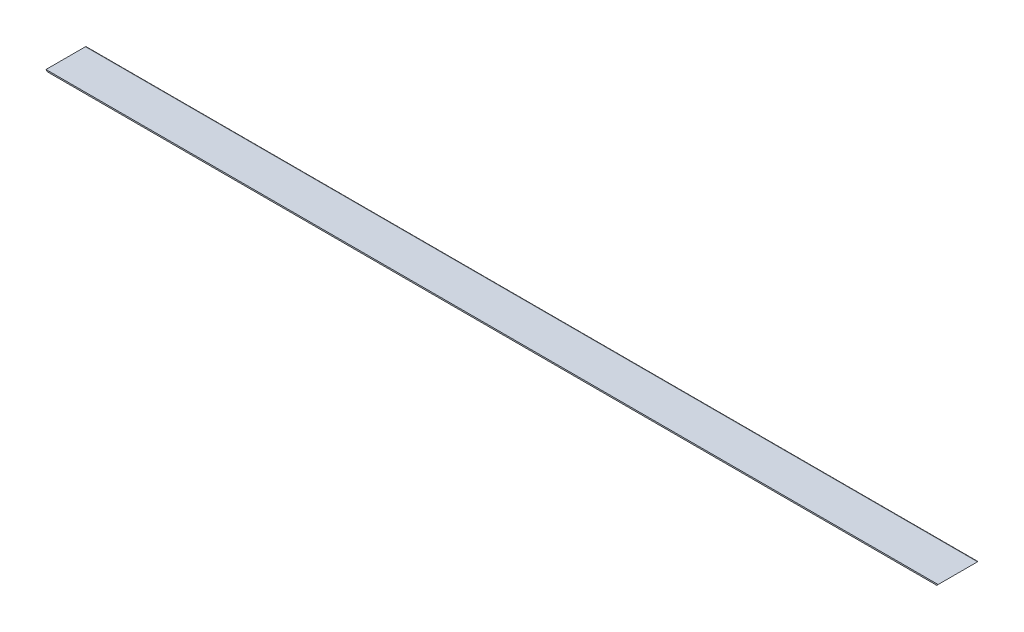
ISO-10303-21;
HEADER;
FILE_DESCRIPTION(('STEP AP214'),'2;1');
FILE_NAME('part.step','',(''),(''),'','','');
FILE_SCHEMA(('AUTOMOTIVE_DESIGN { 1 0 10303 214 1 1 1 1 }'));
ENDSEC;
DATA;
#1=APPLICATION_CONTEXT('core data for automotive mechanical design processes');
#2=APPLICATION_PROTOCOL_DEFINITION('international standard','automotive_design',2000,#1);
#3=PRODUCT_CONTEXT('',#1,'mechanical');
#4=PRODUCT('Part','Part','',(#3));
#5=PRODUCT_RELATED_PRODUCT_CATEGORY('part','',(#4));
#6=PRODUCT_DEFINITION_FORMATION('','',#4);
#7=PRODUCT_DEFINITION_CONTEXT('part definition',#1,'design');
#8=PRODUCT_DEFINITION('design','',#6,#7);
#9=PRODUCT_DEFINITION_SHAPE('','',#8);
#10=(LENGTH_UNIT() NAMED_UNIT(*) SI_UNIT(.MILLI.,.METRE.));
#11=(NAMED_UNIT(*) PLANE_ANGLE_UNIT() SI_UNIT($,.RADIAN.));
#12=(NAMED_UNIT(*) SI_UNIT($,.STERADIAN.) SOLID_ANGLE_UNIT());
#13=UNCERTAINTY_MEASURE_WITH_UNIT(LENGTH_MEASURE(1.E-05),#10,'distance_accuracy_value','');
#14=(GEOMETRIC_REPRESENTATION_CONTEXT(3) GLOBAL_UNCERTAINTY_ASSIGNED_CONTEXT((#13)) GLOBAL_UNIT_ASSIGNED_CONTEXT((#10,
#11,#12)) REPRESENTATION_CONTEXT('',''));
#15=CARTESIAN_POINT('',(0.,0.,0.));
#16=DIRECTION('',(0.,0.,1.));
#17=DIRECTION('',(1.,0.,0.));
#18=AXIS2_PLACEMENT_3D('',#15,#16,#17);
#19=CARTESIAN_POINT('',(1930.,0.,0.));
#20=DIRECTION('',(0.,0.,-1.));
#21=DIRECTION('',(-1.,0.,0.));
#22=AXIS2_PLACEMENT_3D('',#19,#20,#21);
#23=PLANE('',#22);
#24=DIRECTION('',(-1.,0.,0.));
#25=VECTOR('',#24,1.);
#26=CARTESIAN_POINT('',(1930.,-3.,0.));
#27=LINE('',#26,#25);
#28=CARTESIAN_POINT('',(1927.,-3.,0.));
#29=VERTEX_POINT('',#28);
#30=CARTESIAN_POINT('',(3.00000000000008,-3.00000000000006,0.));
#31=VERTEX_POINT('',#30);
#32=EDGE_CURVE('E110',#29,#31,#27,.T.);
#33=ORIENTED_EDGE('',*,*,#32,.F.);
#34=DIRECTION('',(0.707106781186543,0.707106781186552,0.));
#35=VECTOR('',#34,1.);
#36=CARTESIAN_POINT('',(1930.,0.,0.));
#37=LINE('',#36,#35);
#38=CARTESIAN_POINT('',(1930.,0.,0.));
#39=VERTEX_POINT('',#38);
#40=EDGE_CURVE('E98',#29,#39,#37,.T.);
#41=ORIENTED_EDGE('',*,*,#40,.T.);
#42=DIRECTION('',(-1.,0.,0.));
#43=VECTOR('',#42,1.);
#44=CARTESIAN_POINT('',(1930.,0.,0.));
#45=LINE('',#44,#43);
#46=CARTESIAN_POINT('',(0.,0.,0.));
#47=VERTEX_POINT('',#46);
#48=EDGE_CURVE('E104',#39,#47,#45,.T.);
#49=ORIENTED_EDGE('',*,*,#48,.T.);
#50=DIRECTION('',(0.707106781186543,-0.707106781186553,0.));
#51=VECTOR('',#50,1.);
#52=CARTESIAN_POINT('',(0.,0.,0.));
#53=LINE('',#52,#51);
#54=EDGE_CURVE('E142',#47,#31,#53,.T.);
#55=ORIENTED_EDGE('',*,*,#54,.T.);
#56=EDGE_LOOP('',(#33,#41,#49,#55));
#57=FACE_BOUND('',#56,.T.);
#58=ADVANCED_FACE('F33',(#57),#23,.F.);
#59=CARTESIAN_POINT('',(1930.,-3.,0.));
#60=DIRECTION('',(0.,1.,0.));
#61=DIRECTION('',(0.,0.,1.));
#62=AXIS2_PLACEMENT_3D('',#59,#60,#61);
#63=PLANE('',#62);
#64=DIRECTION('',(-1.,0.,0.));
#65=VECTOR('',#64,1.);
#66=CARTESIAN_POINT('',(1930.,-3.,-82.));
#67=LINE('',#66,#65);
#68=CARTESIAN_POINT('',(2.99999999999989,-3.,-82.));
#69=VERTEX_POINT('',#68);
#70=CARTESIAN_POINT('',(1927.,-3.,-82.));
#71=VERTEX_POINT('',#70);
#72=EDGE_CURVE('E124',#69,#71,#67,.F.);
#73=ORIENTED_EDGE('',*,*,#72,.T.);
#74=DIRECTION('',(0.,0.,1.));
#75=VECTOR('',#74,1.);
#76=CARTESIAN_POINT('',(1927.,-3.,0.));
#77=LINE('',#76,#75);
#78=EDGE_CURVE('E143',#71,#29,#77,.T.);
#79=ORIENTED_EDGE('',*,*,#78,.T.);
#80=ORIENTED_EDGE('',*,*,#32,.T.);
#81=DIRECTION('',(0.,0.,-1.));
#82=VECTOR('',#81,1.);
#83=CARTESIAN_POINT('',(3.00000000000011,-3.,-6.07784025128593E-13));
#84=LINE('',#83,#82);
#85=EDGE_CURVE('E244',#31,#69,#84,.T.);
#86=ORIENTED_EDGE('',*,*,#85,.T.);
#87=EDGE_LOOP('',(#73,#79,#80,#86));
#88=FACE_BOUND('',#87,.T.);
#89=ADVANCED_FACE('F154',(#88),#63,.F.);
#90=CARTESIAN_POINT('',(1930.,-3.,-85.));
#91=DIRECTION('',(0.,0.,-1.));
#92=DIRECTION('',(-1.,0.,0.));
#93=AXIS2_PLACEMENT_3D('',#90,#91,#92);
#94=PLANE('',#93);
#95=DIRECTION('',(-1.,0.,0.));
#96=VECTOR('',#95,1.);
#97=CARTESIAN_POINT('',(1930.,-88.,-85.));
#98=LINE('',#97,#96);
#99=CARTESIAN_POINT('',(1842.,-88.,-85.));
#100=VERTEX_POINT('',#99);
#101=CARTESIAN_POINT('',(87.9999999999987,-88.,-85.));
#102=VERTEX_POINT('',#101);
#103=EDGE_CURVE('E116',#100,#102,#98,.T.);
#104=ORIENTED_EDGE('',*,*,#103,.F.);
#105=DIRECTION('',(0.707106781186543,0.707106781186552,0.));
#106=VECTOR('',#105,1.);
#107=CARTESIAN_POINT('',(1928.5,-1.50000000000002,-85.));
#108=LINE('',#107,#106);
#109=CARTESIAN_POINT('',(1924.,-6.,-85.));
#110=VERTEX_POINT('',#109);
#111=EDGE_CURVE('E252',#100,#110,#108,.T.);
#112=ORIENTED_EDGE('',*,*,#111,.T.);
#113=DIRECTION('',(-1.,0.,0.));
#114=VECTOR('',#113,1.);
#115=CARTESIAN_POINT('',(0.,-6.,-85.));
#116=LINE('',#115,#114);
#117=CARTESIAN_POINT('',(6.00000000000001,-6.,-85.));
#118=VERTEX_POINT('',#117);
#119=EDGE_CURVE('E122',#110,#118,#116,.T.);
#120=ORIENTED_EDGE('',*,*,#119,.T.);
#121=DIRECTION('',(0.707106781186543,-0.707106781186552,0.));
#122=VECTOR('',#121,1.);
#123=CARTESIAN_POINT('',(966.499999999987,-966.5,-85.));
#124=LINE('',#123,#122);
#125=EDGE_CURVE('E239',#118,#102,#124,.T.);
#126=ORIENTED_EDGE('',*,*,#125,.T.);
#127=EDGE_LOOP('',(#104,#112,#120,#126));
#128=FACE_BOUND('',#127,.T.);
#129=ADVANCED_FACE('F159',(#128),#94,.F.);
#130=CARTESIAN_POINT('',(1930.,-88.,-85.));
#131=DIRECTION('',(0.,1.,0.));
#132=DIRECTION('',(0.,0.,1.));
#133=AXIS2_PLACEMENT_3D('',#130,#131,#132);
#134=PLANE('',#133);
#135=DIRECTION('',(-1.,0.,0.));
#136=VECTOR('',#135,1.);
#137=CARTESIAN_POINT('',(1930.,-88.,-88.));
#138=LINE('',#137,#136);
#139=CARTESIAN_POINT('',(1842.,-88.,-88.));
#140=VERTEX_POINT('',#139);
#141=CARTESIAN_POINT('',(87.9999999999987,-88.,-88.));
#142=VERTEX_POINT('',#141);
#143=EDGE_CURVE('E114',#140,#142,#138,.T.);
#144=ORIENTED_EDGE('',*,*,#143,.F.);
#145=DIRECTION('',(0.,0.,-1.));
#146=VECTOR('',#145,1.);
#147=CARTESIAN_POINT('',(1842.,-88.,0.));
#148=LINE('',#147,#146);
#149=EDGE_CURVE('E111',#100,#140,#148,.T.);
#150=ORIENTED_EDGE('',*,*,#149,.F.);
#151=ORIENTED_EDGE('',*,*,#103,.T.);
#152=DIRECTION('',(0.,0.,-1.));
#153=VECTOR('',#152,1.);
#154=CARTESIAN_POINT('',(87.9999999999987,-88.,0.));
#155=LINE('',#154,#153);
#156=EDGE_CURVE('E233',#102,#142,#155,.T.);
#157=ORIENTED_EDGE('',*,*,#156,.T.);
#158=EDGE_LOOP('',(#144,#150,#151,#157));
#159=FACE_BOUND('',#158,.T.);
#160=ADVANCED_FACE('F165',(#159),#134,.F.);
#161=CARTESIAN_POINT('',(1930.,0.,-88.));
#162=DIRECTION('',(0.,0.,1.));
#163=DIRECTION('',(0.,-1.,0.));
#164=AXIS2_PLACEMENT_3D('',#161,#162,#163);
#165=PLANE('',#164);
#166=DIRECTION('',(-1.,0.,0.));
#167=VECTOR('',#166,1.);
#168=CARTESIAN_POINT('',(1930.,-3.,-88.));
#169=LINE('',#168,#167);
#170=CARTESIAN_POINT('',(3.00000000000008,-3.00000000000004,-88.));
#171=VERTEX_POINT('',#170);
#172=CARTESIAN_POINT('',(1927.,-3.,-88.));
#173=VERTEX_POINT('',#172);
#174=EDGE_CURVE('E129',#171,#173,#169,.F.);
#175=ORIENTED_EDGE('',*,*,#174,.T.);
#176=DIRECTION('',(0.707106781186543,0.707106781186552,0.));
#177=VECTOR('',#176,1.);
#178=CARTESIAN_POINT('',(1930.,0.,-88.));
#179=LINE('',#178,#177);
#180=EDGE_CURVE('E47',#140,#173,#179,.T.);
#181=ORIENTED_EDGE('',*,*,#180,.F.);
#182=ORIENTED_EDGE('',*,*,#143,.T.);
#183=DIRECTION('',(0.707106781186543,-0.707106781186553,0.));
#184=VECTOR('',#183,1.);
#185=CARTESIAN_POINT('',(0.,0.,-88.));
#186=LINE('',#185,#184);
#187=EDGE_CURVE('E135',#171,#142,#186,.T.);
#188=ORIENTED_EDGE('',*,*,#187,.F.);
#189=EDGE_LOOP('',(#175,#181,#182,#188));
#190=FACE_BOUND('',#189,.T.);
#191=ADVANCED_FACE('F140',(#190),#165,.F.);
#192=CARTESIAN_POINT('',(1930.,0.,0.));
#193=DIRECTION('',(0.,-1.,0.));
#194=DIRECTION('',(0.,0.,-1.));
#195=AXIS2_PLACEMENT_3D('',#192,#193,#194);
#196=PLANE('',#195);
#197=DIRECTION('',(0.,0.,1.));
#198=VECTOR('',#197,1.);
#199=CARTESIAN_POINT('',(1930.,0.,0.));
#200=LINE('',#199,#198);
#201=CARTESIAN_POINT('',(1930.,0.,-85.));
#202=VERTEX_POINT('',#201);
#203=EDGE_CURVE('E95',#202,#39,#200,.T.);
#204=ORIENTED_EDGE('',*,*,#203,.F.);
#205=DIRECTION('',(-1.,0.,0.));
#206=VECTOR('',#205,1.);
#207=CARTESIAN_POINT('',(1930.,0.,-85.));
#208=LINE('',#207,#206);
#209=CARTESIAN_POINT('',(0.,0.,-85.));
#210=VERTEX_POINT('',#209);
#211=EDGE_CURVE('E127',#202,#210,#208,.T.);
#212=ORIENTED_EDGE('',*,*,#211,.T.);
#213=DIRECTION('',(0.,0.,1.));
#214=VECTOR('',#213,1.);
#215=CARTESIAN_POINT('',(0.,0.,0.));
#216=LINE('',#215,#214);
#217=EDGE_CURVE('E55',#210,#47,#216,.T.);
#218=ORIENTED_EDGE('',*,*,#217,.T.);
#219=ORIENTED_EDGE('',*,*,#48,.F.);
#220=EDGE_LOOP('',(#204,#212,#218,#219));
#221=FACE_BOUND('',#220,.T.);
#222=ADVANCED_FACE('F113',(#221),#196,.F.);
#223=CARTESIAN_POINT('',(1930.,-6.,-82.));
#224=DIRECTION('',(1.,0.,0.));
#225=DIRECTION('',(0.,0.,-1.));
#226=AXIS2_PLACEMENT_3D('',#223,#224,#225);
#227=CYLINDRICAL_SURFACE('',#226,3.);
#228=ORIENTED_EDGE('',*,*,#119,.F.);
#229=CARTESIAN_POINT('',(1924.,-6.,-82.));
#230=DIRECTION('',(-0.707106781186552,0.707106781186543,0.));
#231=DIRECTION('',(0.707106781186543,0.707106781186552,0.));
#232=AXIS2_PLACEMENT_3D('',#229,#230,#231);
#233=ELLIPSE('',#232,4.24264068711926,3.);
#234=EDGE_CURVE('E250',#110,#71,#233,.F.);
#235=ORIENTED_EDGE('',*,*,#234,.T.);
#236=ORIENTED_EDGE('',*,*,#72,.F.);
#237=CARTESIAN_POINT('',(6.00000000000001,-6.,-82.));
#238=DIRECTION('',(0.707106781186552,0.707106781186543,0.));
#239=DIRECTION('',(0.707106781186543,-0.707106781186552,0.));
#240=AXIS2_PLACEMENT_3D('',#237,#238,#239);
#241=ELLIPSE('',#240,4.24264068711926,3.);
#242=EDGE_CURVE('E236',#69,#118,#241,.F.);
#243=ORIENTED_EDGE('',*,*,#242,.T.);
#244=EDGE_LOOP('',(#228,#235,#236,#243));
#245=FACE_BOUND('',#244,.T.);
#246=ADVANCED_FACE('F146',(#245),#227,.F.);
#247=CARTESIAN_POINT('',(1930.,-3.,-85.));
#248=DIRECTION('',(-1.,0.,0.));
#249=DIRECTION('',(0.,0.,1.));
#250=AXIS2_PLACEMENT_3D('',#247,#248,#249);
#251=CYLINDRICAL_SURFACE('',#250,3.);
#252=CARTESIAN_POINT('',(1927.,-3.,-85.));
#253=DIRECTION('',(-0.707106781186552,0.707106781186543,0.));
#254=DIRECTION('',(-0.707106781186543,-0.707106781186552,0.));
#255=AXIS2_PLACEMENT_3D('',#252,#253,#254);
#256=ELLIPSE('',#255,4.24264068711926,3.);
#257=EDGE_CURVE('E11',#173,#202,#256,.F.);
#258=ORIENTED_EDGE('',*,*,#257,.F.);
#259=ORIENTED_EDGE('',*,*,#174,.F.);
#260=CARTESIAN_POINT('',(3.00000000000011,-3.,-85.));
#261=DIRECTION('',(0.707106781186552,0.707106781186543,0.));
#262=DIRECTION('',(-0.707106781186543,0.707106781186552,0.));
#263=AXIS2_PLACEMENT_3D('',#260,#261,#262);
#264=ELLIPSE('',#263,4.24264068711926,3.);
#265=EDGE_CURVE('E41',#210,#171,#264,.F.);
#266=ORIENTED_EDGE('',*,*,#265,.F.);
#267=ORIENTED_EDGE('',*,*,#211,.F.);
#268=EDGE_LOOP('',(#258,#259,#266,#267));
#269=FACE_BOUND('',#268,.T.);
#270=ADVANCED_FACE('F35',(#269),#251,.T.);
#271=CARTESIAN_POINT('',(0.,0.,0.));
#272=DIRECTION('',(0.707106781186552,0.707106781186543,0.));
#273=DIRECTION('',(-0.707106781186543,0.707106781186552,0.));
#274=AXIS2_PLACEMENT_3D('',#271,#272,#273);
#275=PLANE('',#274);
#276=ORIENTED_EDGE('',*,*,#54,.F.);
#277=ORIENTED_EDGE('',*,*,#217,.F.);
#278=ORIENTED_EDGE('',*,*,#265,.T.);
#279=ORIENTED_EDGE('',*,*,#187,.T.);
#280=ORIENTED_EDGE('',*,*,#156,.F.);
#281=ORIENTED_EDGE('',*,*,#125,.F.);
#282=ORIENTED_EDGE('',*,*,#242,.F.);
#283=ORIENTED_EDGE('',*,*,#85,.F.);
#284=EDGE_LOOP('',(#276,#277,#278,#279,#280,#281,#282,#283));
#285=FACE_BOUND('',#284,.T.);
#286=ADVANCED_FACE('F133',(#285),#275,.F.);
#287=CARTESIAN_POINT('',(1930.,0.,0.));
#288=DIRECTION('',(-0.707106781186552,0.707106781186543,0.));
#289=DIRECTION('',(-0.707106781186543,-0.707106781186552,0.));
#290=AXIS2_PLACEMENT_3D('',#287,#288,#289);
#291=PLANE('',#290);
#292=ORIENTED_EDGE('',*,*,#234,.F.);
#293=ORIENTED_EDGE('',*,*,#111,.F.);
#294=ORIENTED_EDGE('',*,*,#149,.T.);
#295=ORIENTED_EDGE('',*,*,#180,.T.);
#296=ORIENTED_EDGE('',*,*,#257,.T.);
#297=ORIENTED_EDGE('',*,*,#203,.T.);
#298=ORIENTED_EDGE('',*,*,#40,.F.);
#299=ORIENTED_EDGE('',*,*,#78,.F.);
#300=EDGE_LOOP('',(#292,#293,#294,#295,#296,#297,#298,#299));
#301=FACE_BOUND('',#300,.T.);
#302=ADVANCED_FACE('F97',(#301),#291,.F.);
#303=CLOSED_SHELL('',(#58,#89,#129,#160,#191,#222,#246,#270,#286,#302));
#304=MANIFOLD_SOLID_BREP('B2',#303);
#305=ADVANCED_BREP_SHAPE_REPRESENTATION('',(#18,#304),#14);
#306=SHAPE_DEFINITION_REPRESENTATION(#9,#305);
ENDSEC;
END-ISO-10303-21;
